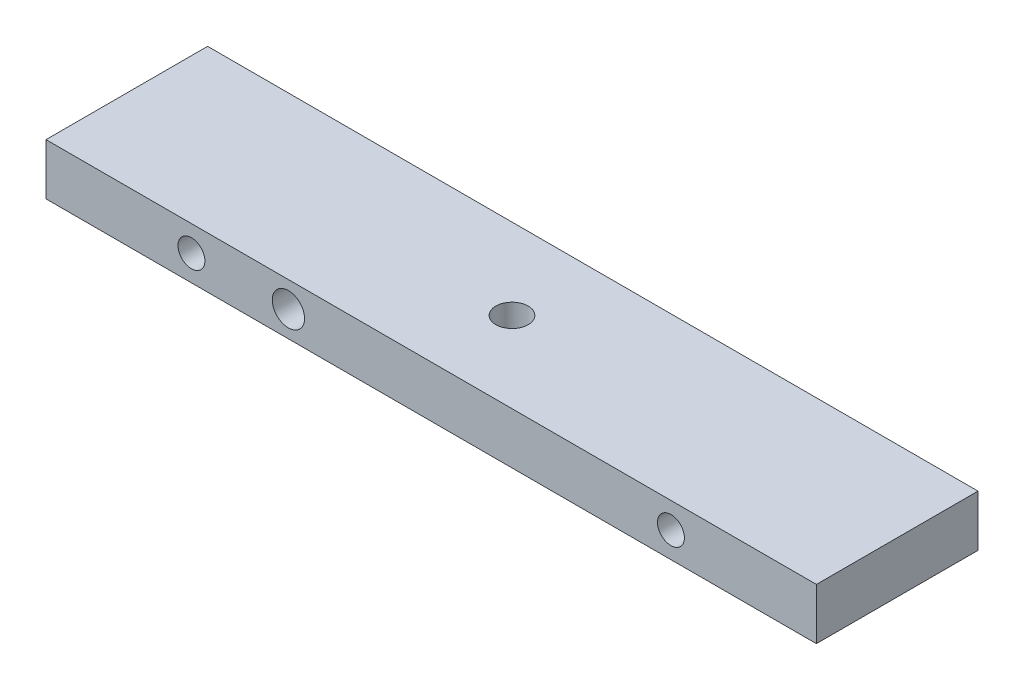
ISO-10303-21;
HEADER;
FILE_DESCRIPTION(('STEP AP214'),'2;1');
FILE_NAME('part.step','',(''),(''),'','','');
FILE_SCHEMA(('AUTOMOTIVE_DESIGN { 1 0 10303 214 1 1 1 1 }'));
ENDSEC;
DATA;
#1=APPLICATION_CONTEXT('core data for automotive mechanical design processes');
#2=APPLICATION_PROTOCOL_DEFINITION('international standard','automotive_design',2000,#1);
#3=PRODUCT_CONTEXT('',#1,'mechanical');
#4=PRODUCT('Part','Part','',(#3));
#5=PRODUCT_RELATED_PRODUCT_CATEGORY('part','',(#4));
#6=PRODUCT_DEFINITION_FORMATION('','',#4);
#7=PRODUCT_DEFINITION_CONTEXT('part definition',#1,'design');
#8=PRODUCT_DEFINITION('design','',#6,#7);
#9=PRODUCT_DEFINITION_SHAPE('','',#8);
#10=(LENGTH_UNIT() NAMED_UNIT(*) SI_UNIT(.MILLI.,.METRE.));
#11=(NAMED_UNIT(*) PLANE_ANGLE_UNIT() SI_UNIT($,.RADIAN.));
#12=(NAMED_UNIT(*) SI_UNIT($,.STERADIAN.) SOLID_ANGLE_UNIT());
#13=UNCERTAINTY_MEASURE_WITH_UNIT(LENGTH_MEASURE(1.E-05),#10,'distance_accuracy_value','');
#14=(GEOMETRIC_REPRESENTATION_CONTEXT(3) GLOBAL_UNCERTAINTY_ASSIGNED_CONTEXT((#13)) GLOBAL_UNIT_ASSIGNED_CONTEXT((#10,
#11,#12)) REPRESENTATION_CONTEXT('',''));
#15=CARTESIAN_POINT('',(0.,0.,0.));
#16=DIRECTION('',(0.,0.,1.));
#17=DIRECTION('',(1.,0.,0.));
#18=AXIS2_PLACEMENT_3D('',#15,#16,#17);
#19=CARTESIAN_POINT('',(-25.,-4.765,30.));
#20=DIRECTION('',(0.,1.,0.));
#21=DIRECTION('',(0.,0.,1.));
#22=AXIS2_PLACEMENT_3D('',#19,#20,#21);
#23=PLANE('',#22);
#24=CARTESIAN_POINT('',(13.505,-4.765,15.));
#25=DIRECTION('',(0.,1.,0.));
#26=DIRECTION('',(0.,0.,1.));
#27=AXIS2_PLACEMENT_3D('',#24,#25,#26);
#28=CIRCLE('',#27,3.);
#29=CARTESIAN_POINT('',(13.505,-4.765,18.));
#30=VERTEX_POINT('',#29);
#31=EDGE_CURVE('E137',#30,#30,#28,.F.);
#32=ORIENTED_EDGE('',*,*,#31,.F.);
#33=EDGE_LOOP('',(#32));
#34=FACE_BOUND('',#33,.T.);
#35=DIRECTION('',(1.,0.,0.));
#36=VECTOR('',#35,1.);
#37=CARTESIAN_POINT('',(-25.,-4.765,0.));
#38=LINE('',#37,#36);
#39=CARTESIAN_POINT('',(-58.,-4.76500000000001,0.));
#40=VERTEX_POINT('',#39);
#41=CARTESIAN_POINT('',(85.01,-4.76499999999998,0.));
#42=VERTEX_POINT('',#41);
#43=EDGE_CURVE('E77',#40,#42,#38,.T.);
#44=ORIENTED_EDGE('',*,*,#43,.T.);
#45=DIRECTION('',(0.,0.,-1.));
#46=VECTOR('',#45,1.);
#47=CARTESIAN_POINT('',(85.01,-4.76499999999998,30.));
#48=LINE('',#47,#46);
#49=CARTESIAN_POINT('',(85.01,-4.76499999999998,30.));
#50=VERTEX_POINT('',#49);
#51=EDGE_CURVE('E98',#50,#42,#48,.T.);
#52=ORIENTED_EDGE('',*,*,#51,.F.);
#53=DIRECTION('',(1.,0.,0.));
#54=VECTOR('',#53,1.);
#55=CARTESIAN_POINT('',(-25.,-4.765,30.));
#56=LINE('',#55,#54);
#57=CARTESIAN_POINT('',(-58.,-4.76500000000001,30.));
#58=VERTEX_POINT('',#57);
#59=EDGE_CURVE('E39',#58,#50,#56,.T.);
#60=ORIENTED_EDGE('',*,*,#59,.F.);
#61=DIRECTION('',(0.,0.,1.));
#62=VECTOR('',#61,1.);
#63=CARTESIAN_POINT('',(-58.,-4.76500000000001,0.));
#64=LINE('',#63,#62);
#65=EDGE_CURVE('E84',#40,#58,#64,.T.);
#66=ORIENTED_EDGE('',*,*,#65,.F.);
#67=EDGE_LOOP('',(#44,#52,#60,#66));
#68=FACE_BOUND('',#67,.T.);
#69=ADVANCED_FACE('F31',(#34,#68),#23,.F.);
#70=CARTESIAN_POINT('',(-25.,4.765,30.));
#71=DIRECTION('',(0.,-1.,0.));
#72=DIRECTION('',(0.,0.,-1.));
#73=AXIS2_PLACEMENT_3D('',#70,#71,#72);
#74=PLANE('',#73);
#75=CARTESIAN_POINT('',(13.505,4.765,15.));
#76=DIRECTION('',(0.,1.,0.));
#77=DIRECTION('',(0.,0.,1.));
#78=AXIS2_PLACEMENT_3D('',#75,#76,#77);
#79=CIRCLE('',#78,3.);
#80=CARTESIAN_POINT('',(13.505,4.765,18.));
#81=VERTEX_POINT('',#80);
#82=EDGE_CURVE('E140',#81,#81,#79,.T.);
#83=ORIENTED_EDGE('',*,*,#82,.F.);
#84=EDGE_LOOP('',(#83));
#85=FACE_BOUND('',#84,.T.);
#86=DIRECTION('',(-1.,0.,0.));
#87=VECTOR('',#86,1.);
#88=CARTESIAN_POINT('',(-25.,4.765,0.));
#89=LINE('',#88,#87);
#90=CARTESIAN_POINT('',(85.01,4.76500000000002,0.));
#91=VERTEX_POINT('',#90);
#92=CARTESIAN_POINT('',(-58.,4.76499999999998,0.));
#93=VERTEX_POINT('',#92);
#94=EDGE_CURVE('E34',#91,#93,#89,.T.);
#95=ORIENTED_EDGE('',*,*,#94,.T.);
#96=DIRECTION('',(0.,0.,-1.));
#97=VECTOR('',#96,1.);
#98=CARTESIAN_POINT('',(-58.,4.76499999999998,30.));
#99=LINE('',#98,#97);
#100=CARTESIAN_POINT('',(-58.,4.76499999999998,30.));
#101=VERTEX_POINT('',#100);
#102=EDGE_CURVE('E72',#101,#93,#99,.T.);
#103=ORIENTED_EDGE('',*,*,#102,.F.);
#104=DIRECTION('',(-1.,0.,0.));
#105=VECTOR('',#104,1.);
#106=CARTESIAN_POINT('',(-25.,4.765,30.));
#107=LINE('',#106,#105);
#108=CARTESIAN_POINT('',(85.01,4.76500000000002,30.));
#109=VERTEX_POINT('',#108);
#110=EDGE_CURVE('E11',#109,#101,#107,.T.);
#111=ORIENTED_EDGE('',*,*,#110,.F.);
#112=DIRECTION('',(0.,0.,1.));
#113=VECTOR('',#112,1.);
#114=CARTESIAN_POINT('',(85.01,4.76500000000002,0.));
#115=LINE('',#114,#113);
#116=EDGE_CURVE('E73',#91,#109,#115,.T.);
#117=ORIENTED_EDGE('',*,*,#116,.F.);
#118=EDGE_LOOP('',(#95,#103,#111,#117));
#119=FACE_BOUND('',#118,.T.);
#120=ADVANCED_FACE('F70',(#85,#119),#74,.F.);
#121=CARTESIAN_POINT('',(-25.,-4.765,30.));
#122=DIRECTION('',(0.,0.,1.));
#123=DIRECTION('',(1.,0.,0.));
#124=AXIS2_PLACEMENT_3D('',#121,#122,#123);
#125=PLANE('',#124);
#126=CARTESIAN_POINT('',(58.01,0.,30.));
#127=DIRECTION('',(0.,0.,1.));
#128=DIRECTION('',(1.,0.,0.));
#129=AXIS2_PLACEMENT_3D('',#126,#127,#128);
#130=CIRCLE('',#129,2.5);
#131=CARTESIAN_POINT('',(60.51,0.,30.));
#132=VERTEX_POINT('',#131);
#133=EDGE_CURVE('E139',#132,#132,#130,.T.);
#134=ORIENTED_EDGE('',*,*,#133,.F.);
#135=EDGE_LOOP('',(#134));
#136=FACE_BOUND('',#135,.T.);
#137=CARTESIAN_POINT('',(-31.,0.,30.));
#138=DIRECTION('',(0.,0.,1.));
#139=DIRECTION('',(1.,0.,0.));
#140=AXIS2_PLACEMENT_3D('',#137,#138,#139);
#141=CIRCLE('',#140,2.5);
#142=CARTESIAN_POINT('',(-28.5,0.,30.));
#143=VERTEX_POINT('',#142);
#144=EDGE_CURVE('E92',#143,#143,#141,.T.);
#145=ORIENTED_EDGE('',*,*,#144,.F.);
#146=EDGE_LOOP('',(#145));
#147=FACE_BOUND('',#146,.T.);
#148=CARTESIAN_POINT('',(-13.,0.,30.));
#149=DIRECTION('',(0.,0.,1.));
#150=DIRECTION('',(1.,0.,0.));
#151=AXIS2_PLACEMENT_3D('',#148,#149,#150);
#152=CIRCLE('',#151,3.);
#153=CARTESIAN_POINT('',(-10.,0.,30.));
#154=VERTEX_POINT('',#153);
#155=EDGE_CURVE('E106',#154,#154,#152,.T.);
#156=ORIENTED_EDGE('',*,*,#155,.F.);
#157=EDGE_LOOP('',(#156));
#158=FACE_BOUND('',#157,.T.);
#159=ORIENTED_EDGE('',*,*,#110,.T.);
#160=DIRECTION('',(0.,1.,0.));
#161=VECTOR('',#160,1.);
#162=CARTESIAN_POINT('',(-58.,-4.76500000000001,30.));
#163=LINE('',#162,#161);
#164=EDGE_CURVE('E88',#58,#101,#163,.T.);
#165=ORIENTED_EDGE('',*,*,#164,.F.);
#166=ORIENTED_EDGE('',*,*,#59,.T.);
#167=DIRECTION('',(0.,-1.,0.));
#168=VECTOR('',#167,1.);
#169=CARTESIAN_POINT('',(85.01,4.76500000000002,30.));
#170=LINE('',#169,#168);
#171=EDGE_CURVE('E104',#109,#50,#170,.T.);
#172=ORIENTED_EDGE('',*,*,#171,.F.);
#173=EDGE_LOOP('',(#159,#165,#166,#172));
#174=FACE_BOUND('',#173,.T.);
#175=ADVANCED_FACE('F116',(#136,#147,#158,#174),#125,.T.);
#176=CARTESIAN_POINT('',(-25.,-4.765,0.));
#177=DIRECTION('',(0.,0.,1.));
#178=DIRECTION('',(1.,0.,0.));
#179=AXIS2_PLACEMENT_3D('',#176,#177,#178);
#180=PLANE('',#179);
#181=CARTESIAN_POINT('',(-13.,0.,0.));
#182=DIRECTION('',(0.,0.,1.));
#183=DIRECTION('',(1.,0.,0.));
#184=AXIS2_PLACEMENT_3D('',#181,#182,#183);
#185=CIRCLE('',#184,3.);
#186=CARTESIAN_POINT('',(-10.,0.,0.));
#187=VERTEX_POINT('',#186);
#188=EDGE_CURVE('E107',#187,#187,#185,.T.);
#189=ORIENTED_EDGE('',*,*,#188,.T.);
#190=EDGE_LOOP('',(#189));
#191=FACE_BOUND('',#190,.T.);
#192=ORIENTED_EDGE('',*,*,#43,.F.);
#193=DIRECTION('',(0.,-1.,0.));
#194=VECTOR('',#193,1.);
#195=CARTESIAN_POINT('',(-58.,4.76499999999998,0.));
#196=LINE('',#195,#194);
#197=EDGE_CURVE('E79',#93,#40,#196,.T.);
#198=ORIENTED_EDGE('',*,*,#197,.F.);
#199=ORIENTED_EDGE('',*,*,#94,.F.);
#200=DIRECTION('',(0.,1.,0.));
#201=VECTOR('',#200,1.);
#202=CARTESIAN_POINT('',(85.01,-4.76499999999998,0.));
#203=LINE('',#202,#201);
#204=EDGE_CURVE('E101',#42,#91,#203,.T.);
#205=ORIENTED_EDGE('',*,*,#204,.F.);
#206=EDGE_LOOP('',(#192,#198,#199,#205));
#207=FACE_BOUND('',#206,.T.);
#208=ADVANCED_FACE('F80',(#191,#207),#180,.F.);
#209=CARTESIAN_POINT('',(-13.,0.,0.));
#210=DIRECTION('',(0.,0.,1.));
#211=DIRECTION('',(1.,0.,0.));
#212=AXIS2_PLACEMENT_3D('',#209,#210,#211);
#213=CYLINDRICAL_SURFACE('',#212,3.);
#214=ORIENTED_EDGE('',*,*,#188,.F.);
#215=EDGE_LOOP('',(#214));
#216=FACE_BOUND('',#215,.T.);
#217=ORIENTED_EDGE('',*,*,#155,.T.);
#218=EDGE_LOOP('',(#217));
#219=FACE_BOUND('',#218,.T.);
#220=ADVANCED_FACE('F124',(#216,#219),#213,.F.);
#221=CARTESIAN_POINT('',(85.01,-4.76499999999998,0.));
#222=DIRECTION('',(1.,0.,0.));
#223=DIRECTION('',(0.,1.,0.));
#224=AXIS2_PLACEMENT_3D('',#221,#222,#223);
#225=PLANE('',#224);
#226=ORIENTED_EDGE('',*,*,#51,.T.);
#227=ORIENTED_EDGE('',*,*,#204,.T.);
#228=ORIENTED_EDGE('',*,*,#116,.T.);
#229=ORIENTED_EDGE('',*,*,#171,.T.);
#230=EDGE_LOOP('',(#226,#227,#228,#229));
#231=FACE_BOUND('',#230,.T.);
#232=ADVANCED_FACE('F115',(#231),#225,.T.);
#233=CARTESIAN_POINT('',(-58.,4.76499999999998,0.));
#234=DIRECTION('',(-1.,0.,0.));
#235=DIRECTION('',(0.,-1.,0.));
#236=AXIS2_PLACEMENT_3D('',#233,#234,#235);
#237=PLANE('',#236);
#238=ORIENTED_EDGE('',*,*,#102,.T.);
#239=ORIENTED_EDGE('',*,*,#197,.T.);
#240=ORIENTED_EDGE('',*,*,#65,.T.);
#241=ORIENTED_EDGE('',*,*,#164,.T.);
#242=EDGE_LOOP('',(#238,#239,#240,#241));
#243=FACE_BOUND('',#242,.T.);
#244=ADVANCED_FACE('F87',(#243),#237,.T.);
#245=CARTESIAN_POINT('',(-31.,0.,20.));
#246=DIRECTION('',(0.,0.,1.));
#247=DIRECTION('',(1.,0.,0.));
#248=AXIS2_PLACEMENT_3D('',#245,#246,#247);
#249=CYLINDRICAL_SURFACE('',#248,2.5);
#250=CARTESIAN_POINT('',(-31.,0.,20.));
#251=DIRECTION('',(0.,0.,1.));
#252=DIRECTION('',(1.,0.,0.));
#253=AXIS2_PLACEMENT_3D('',#250,#251,#252);
#254=CIRCLE('',#253,2.5);
#255=CARTESIAN_POINT('',(-28.5,0.,20.));
#256=VERTEX_POINT('',#255);
#257=EDGE_CURVE('E89',#256,#256,#254,.T.);
#258=ORIENTED_EDGE('',*,*,#257,.F.);
#259=EDGE_LOOP('',(#258));
#260=FACE_BOUND('',#259,.T.);
#261=ORIENTED_EDGE('',*,*,#144,.T.);
#262=EDGE_LOOP('',(#261));
#263=FACE_BOUND('',#262,.T.);
#264=ADVANCED_FACE('F154',(#260,#263),#249,.F.);
#265=CARTESIAN_POINT('',(-31.,0.,20.));
#266=DIRECTION('',(0.,0.,1.));
#267=DIRECTION('',(1.,0.,0.));
#268=AXIS2_PLACEMENT_3D('',#265,#266,#267);
#269=PLANE('',#268);
#270=ORIENTED_EDGE('',*,*,#257,.T.);
#271=EDGE_LOOP('',(#270));
#272=FACE_BOUND('',#271,.T.);
#273=ADVANCED_FACE('F170',(#272),#269,.T.);
#274=CARTESIAN_POINT('',(58.01,0.,20.));
#275=DIRECTION('',(0.,0.,1.));
#276=DIRECTION('',(1.,0.,0.));
#277=AXIS2_PLACEMENT_3D('',#274,#275,#276);
#278=CYLINDRICAL_SURFACE('',#277,2.5);
#279=CARTESIAN_POINT('',(58.01,0.,20.));
#280=DIRECTION('',(0.,0.,1.));
#281=DIRECTION('',(1.,0.,0.));
#282=AXIS2_PLACEMENT_3D('',#279,#280,#281);
#283=CIRCLE('',#282,2.5);
#284=CARTESIAN_POINT('',(60.51,0.,20.));
#285=VERTEX_POINT('',#284);
#286=EDGE_CURVE('E143',#285,#285,#283,.T.);
#287=ORIENTED_EDGE('',*,*,#286,.F.);
#288=EDGE_LOOP('',(#287));
#289=FACE_BOUND('',#288,.T.);
#290=ORIENTED_EDGE('',*,*,#133,.T.);
#291=EDGE_LOOP('',(#290));
#292=FACE_BOUND('',#291,.T.);
#293=ADVANCED_FACE('F174',(#289,#292),#278,.F.);
#294=CARTESIAN_POINT('',(58.01,0.,20.));
#295=DIRECTION('',(0.,0.,1.));
#296=DIRECTION('',(1.,0.,0.));
#297=AXIS2_PLACEMENT_3D('',#294,#295,#296);
#298=PLANE('',#297);
#299=ORIENTED_EDGE('',*,*,#286,.T.);
#300=EDGE_LOOP('',(#299));
#301=FACE_BOUND('',#300,.T.);
#302=ADVANCED_FACE('F178',(#301),#298,.T.);
#303=CARTESIAN_POINT('',(13.505,-4.76600000000002,15.));
#304=DIRECTION('',(0.,1.,0.));
#305=DIRECTION('',(0.,0.,1.));
#306=AXIS2_PLACEMENT_3D('',#303,#304,#305);
#307=CYLINDRICAL_SURFACE('',#306,3.);
#308=ORIENTED_EDGE('',*,*,#82,.T.);
#309=EDGE_LOOP('',(#308));
#310=FACE_BOUND('',#309,.T.);
#311=ORIENTED_EDGE('',*,*,#31,.T.);
#312=EDGE_LOOP('',(#311));
#313=FACE_BOUND('',#312,.T.);
#314=ADVANCED_FACE('F182',(#310,#313),#307,.F.);
#315=CLOSED_SHELL('',(#69,#120,#175,#208,#220,#232,#244,#264,#273,#293,#302,#314));
#316=MANIFOLD_SOLID_BREP('B2',#315);
#317=ADVANCED_BREP_SHAPE_REPRESENTATION('',(#18,#316),#14);
#318=SHAPE_DEFINITION_REPRESENTATION(#9,#317);
ENDSEC;
END-ISO-10303-21;
